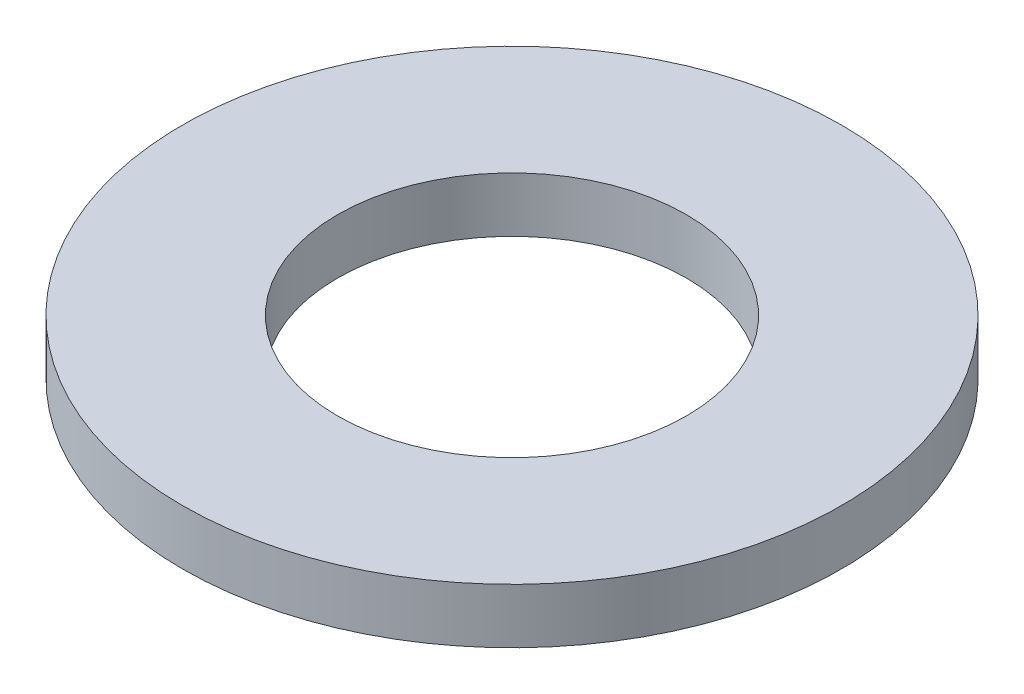
ISO-10303-21;
HEADER;
FILE_DESCRIPTION(('STEP AP214'),'2;1');
FILE_NAME('part.step','',(''),(''),'','','');
FILE_SCHEMA(('AUTOMOTIVE_DESIGN { 1 0 10303 214 1 1 1 1 }'));
ENDSEC;
DATA;
#1=APPLICATION_CONTEXT('core data for automotive mechanical design processes');
#2=APPLICATION_PROTOCOL_DEFINITION('international standard','automotive_design',2000,#1);
#3=PRODUCT_CONTEXT('',#1,'mechanical');
#4=PRODUCT('Part','Part','',(#3));
#5=PRODUCT_RELATED_PRODUCT_CATEGORY('part','',(#4));
#6=PRODUCT_DEFINITION_FORMATION('','',#4);
#7=PRODUCT_DEFINITION_CONTEXT('part definition',#1,'design');
#8=PRODUCT_DEFINITION('design','',#6,#7);
#9=PRODUCT_DEFINITION_SHAPE('','',#8);
#10=(LENGTH_UNIT() NAMED_UNIT(*) SI_UNIT(.MILLI.,.METRE.));
#11=(NAMED_UNIT(*) PLANE_ANGLE_UNIT() SI_UNIT($,.RADIAN.));
#12=(NAMED_UNIT(*) SI_UNIT($,.STERADIAN.) SOLID_ANGLE_UNIT());
#13=UNCERTAINTY_MEASURE_WITH_UNIT(LENGTH_MEASURE(1.E-05),#10,'distance_accuracy_value','');
#14=(GEOMETRIC_REPRESENTATION_CONTEXT(3) GLOBAL_UNCERTAINTY_ASSIGNED_CONTEXT((#13)) GLOBAL_UNIT_ASSIGNED_CONTEXT((#10,
#11,#12)) REPRESENTATION_CONTEXT('',''));
#15=CARTESIAN_POINT('',(0.,0.,0.));
#16=DIRECTION('',(0.,0.,1.));
#17=DIRECTION('',(1.,0.,0.));
#18=AXIS2_PLACEMENT_3D('',#15,#16,#17);
#19=CARTESIAN_POINT('',(0.,1.,0.));
#20=DIRECTION('',(0.,1.,0.));
#21=DIRECTION('',(0.,0.,1.));
#22=AXIS2_PLACEMENT_3D('',#19,#20,#21);
#23=PLANE('',#22);
#24=CARTESIAN_POINT('',(0.,1.,0.));
#25=DIRECTION('',(0.,1.,0.));
#26=DIRECTION('',(0.,0.,1.));
#27=AXIS2_PLACEMENT_3D('',#24,#25,#26);
#28=CIRCLE('',#27,6.);
#29=CARTESIAN_POINT('',(0.,1.,6.));
#30=VERTEX_POINT('',#29);
#31=EDGE_CURVE('E10',#30,#30,#28,.T.);
#32=ORIENTED_EDGE('',*,*,#31,.T.);
#33=EDGE_LOOP('',(#32));
#34=FACE_BOUND('',#33,.T.);
#35=CARTESIAN_POINT('',(0.,1.,0.));
#36=DIRECTION('',(0.,1.,0.));
#37=DIRECTION('',(0.,0.,1.));
#38=AXIS2_PLACEMENT_3D('',#35,#36,#37);
#39=CIRCLE('',#38,3.175);
#40=CARTESIAN_POINT('',(0.,1.,3.175));
#41=VERTEX_POINT('',#40);
#42=EDGE_CURVE('E42',#41,#41,#39,.T.);
#43=ORIENTED_EDGE('',*,*,#42,.F.);
#44=EDGE_LOOP('',(#43));
#45=FACE_BOUND('',#44,.T.);
#46=ADVANCED_FACE('F31',(#34,#45),#23,.T.);
#47=CARTESIAN_POINT('',(0.,0.,0.));
#48=DIRECTION('',(0.,1.,0.));
#49=DIRECTION('',(0.,0.,1.));
#50=AXIS2_PLACEMENT_3D('',#47,#48,#49);
#51=PLANE('',#50);
#52=CARTESIAN_POINT('',(0.,0.,0.));
#53=DIRECTION('',(0.,1.,0.));
#54=DIRECTION('',(0.,0.,1.));
#55=AXIS2_PLACEMENT_3D('',#52,#53,#54);
#56=CIRCLE('',#55,6.);
#57=CARTESIAN_POINT('',(0.,0.,6.));
#58=VERTEX_POINT('',#57);
#59=EDGE_CURVE('E35',#58,#58,#56,.T.);
#60=ORIENTED_EDGE('',*,*,#59,.F.);
#61=EDGE_LOOP('',(#60));
#62=FACE_BOUND('',#61,.T.);
#63=CARTESIAN_POINT('',(0.,0.,0.));
#64=DIRECTION('',(0.,1.,0.));
#65=DIRECTION('',(0.,0.,1.));
#66=AXIS2_PLACEMENT_3D('',#63,#64,#65);
#67=CIRCLE('',#66,3.175);
#68=CARTESIAN_POINT('',(0.,0.,3.175));
#69=VERTEX_POINT('',#68);
#70=EDGE_CURVE('E44',#69,#69,#67,.T.);
#71=ORIENTED_EDGE('',*,*,#70,.T.);
#72=EDGE_LOOP('',(#71));
#73=FACE_BOUND('',#72,.T.);
#74=ADVANCED_FACE('F54',(#62,#73),#51,.F.);
#75=CARTESIAN_POINT('',(0.,1.,0.));
#76=DIRECTION('',(0.,-1.,0.));
#77=DIRECTION('',(0.,0.,-1.));
#78=AXIS2_PLACEMENT_3D('',#75,#76,#77);
#79=CYLINDRICAL_SURFACE('',#78,6.);
#80=ORIENTED_EDGE('',*,*,#31,.F.);
#81=EDGE_LOOP('',(#80));
#82=FACE_BOUND('',#81,.T.);
#83=ORIENTED_EDGE('',*,*,#59,.T.);
#84=EDGE_LOOP('',(#83));
#85=FACE_BOUND('',#84,.T.);
#86=ADVANCED_FACE('F33',(#82,#85),#79,.T.);
#87=CARTESIAN_POINT('',(0.,1.,0.));
#88=DIRECTION('',(0.,-1.,0.));
#89=DIRECTION('',(0.,0.,-1.));
#90=AXIS2_PLACEMENT_3D('',#87,#88,#89);
#91=CYLINDRICAL_SURFACE('',#90,3.175);
#92=ORIENTED_EDGE('',*,*,#42,.T.);
#93=EDGE_LOOP('',(#92));
#94=FACE_BOUND('',#93,.T.);
#95=ORIENTED_EDGE('',*,*,#70,.F.);
#96=EDGE_LOOP('',(#95));
#97=FACE_BOUND('',#96,.T.);
#98=ADVANCED_FACE('F50',(#94,#97),#91,.F.);
#99=CLOSED_SHELL('',(#46,#74,#86,#98));
#100=MANIFOLD_SOLID_BREP('B2',#99);
#101=ADVANCED_BREP_SHAPE_REPRESENTATION('',(#18,#100),#14);
#102=SHAPE_DEFINITION_REPRESENTATION(#9,#101);
ENDSEC;
END-ISO-10303-21;
